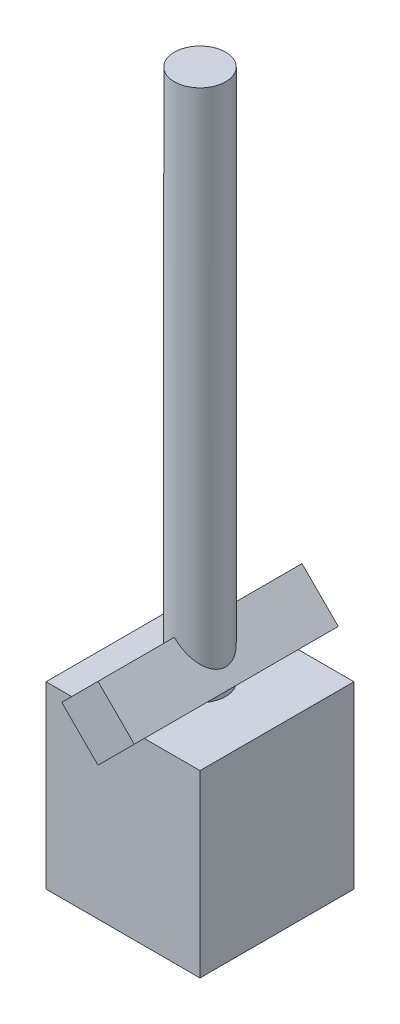
ISO-10303-21;
HEADER;
FILE_DESCRIPTION(('STEP AP214'),'2;1');
FILE_NAME('part.step','',(''),(''),'','','');
FILE_SCHEMA(('AUTOMOTIVE_DESIGN { 1 0 10303 214 1 1 1 1 }'));
ENDSEC;
DATA;
#1=APPLICATION_CONTEXT('core data for automotive mechanical design processes');
#2=APPLICATION_PROTOCOL_DEFINITION('international standard','automotive_design',2000,#1);
#3=PRODUCT_CONTEXT('',#1,'mechanical');
#4=PRODUCT('Part','Part','',(#3));
#5=PRODUCT_RELATED_PRODUCT_CATEGORY('part','',(#4));
#6=PRODUCT_DEFINITION_FORMATION('','',#4);
#7=PRODUCT_DEFINITION_CONTEXT('part definition',#1,'design');
#8=PRODUCT_DEFINITION('design','',#6,#7);
#9=PRODUCT_DEFINITION_SHAPE('','',#8);
#10=(LENGTH_UNIT() NAMED_UNIT(*) SI_UNIT(.MILLI.,.METRE.));
#11=(NAMED_UNIT(*) PLANE_ANGLE_UNIT() SI_UNIT($,.RADIAN.));
#12=(NAMED_UNIT(*) SI_UNIT($,.STERADIAN.) SOLID_ANGLE_UNIT());
#13=UNCERTAINTY_MEASURE_WITH_UNIT(LENGTH_MEASURE(1.E-05),#10,'distance_accuracy_value','');
#14=(GEOMETRIC_REPRESENTATION_CONTEXT(3) GLOBAL_UNCERTAINTY_ASSIGNED_CONTEXT((#13)) GLOBAL_UNIT_ASSIGNED_CONTEXT((#10,
#11,#12)) REPRESENTATION_CONTEXT('',''));
#15=CARTESIAN_POINT('',(0.,0.,0.));
#16=DIRECTION('',(0.,0.,1.));
#17=DIRECTION('',(1.,0.,0.));
#18=AXIS2_PLACEMENT_3D('',#15,#16,#17);
#19=CARTESIAN_POINT('',(0.,-11.3137084989848,15.9));
#20=DIRECTION('',(0.707106781186547,0.707106781186547,0.));
#21=DIRECTION('',(-0.707106781186548,0.707106781186548,0.));
#22=AXIS2_PLACEMENT_3D('',#19,#20,#21);
#23=PLANE('',#22);
#24=CARTESIAN_POINT('',(0.,-11.3137084989848,0.));
#25=DIRECTION('',(0.707106781186547,0.707106781186547,0.));
#26=DIRECTION('',(0.707106781186548,-0.707106781186548,0.));
#27=AXIS2_PLACEMENT_3D('',#24,#25,#26);
#28=ELLIPSE('',#27,5.65685424949238,4.);
#29=CARTESIAN_POINT('',(-3.31370849898476,-8.00000000000001,2.24038746286355));
#30=VERTEX_POINT('',#29);
#31=CARTESIAN_POINT('',(-3.31370849898476,-8.,-2.24038746286355));
#32=VERTEX_POINT('',#31);
#33=EDGE_CURVE('E63',#30,#32,#28,.F.);
#34=ORIENTED_EDGE('',*,*,#33,.F.);
#35=DIRECTION('',(0.,0.,-1.));
#36=VECTOR('',#35,1.);
#37=CARTESIAN_POINT('',(-3.31370849898476,-8.,15.9));
#38=LINE('',#37,#36);
#39=CARTESIAN_POINT('',(-3.31370849898476,-8.,12.));
#40=VERTEX_POINT('',#39);
#41=EDGE_CURVE('E210',#40,#30,#38,.T.);
#42=ORIENTED_EDGE('',*,*,#41,.F.);
#43=DIRECTION('',(0.707106781186548,-0.707106781186548,0.));
#44=VECTOR('',#43,1.);
#45=CARTESIAN_POINT('',(0.,-11.3137084989848,12.));
#46=LINE('',#45,#44);
#47=CARTESIAN_POINT('',(0.,-11.3137084989848,12.));
#48=VERTEX_POINT('',#47);
#49=EDGE_CURVE('E204',#40,#48,#46,.T.);
#50=ORIENTED_EDGE('',*,*,#49,.T.);
#51=DIRECTION('',(0.,0.,-1.));
#52=VECTOR('',#51,1.);
#53=CARTESIAN_POINT('',(0.,-11.3137084989848,15.9));
#54=LINE('',#53,#52);
#55=CARTESIAN_POINT('',(0.,-11.3137084989848,15.9));
#56=VERTEX_POINT('',#55);
#57=EDGE_CURVE('E237',#56,#48,#54,.T.);
#58=ORIENTED_EDGE('',*,*,#57,.F.);
#59=DIRECTION('',(0.707106781186547,-0.707106781186547,0.));
#60=VECTOR('',#59,1.);
#61=CARTESIAN_POINT('',(0.,-11.3137084989848,15.9));
#62=LINE('',#61,#60);
#63=CARTESIAN_POINT('',(-5.65685424949238,-5.65685424949238,15.9));
#64=VERTEX_POINT('',#63);
#65=EDGE_CURVE('E213',#64,#56,#62,.T.);
#66=ORIENTED_EDGE('',*,*,#65,.F.);
#67=DIRECTION('',(0.,0.,-1.));
#68=VECTOR('',#67,1.);
#69=CARTESIAN_POINT('',(-5.65685424949238,-5.65685424949238,15.9));
#70=LINE('',#69,#68);
#71=CARTESIAN_POINT('',(-5.65685424949238,-5.65685424949238,-15.9));
#72=VERTEX_POINT('',#71);
#73=EDGE_CURVE('E236',#64,#72,#70,.T.);
#74=ORIENTED_EDGE('',*,*,#73,.T.);
#75=DIRECTION('',(0.707106781186547,-0.707106781186547,0.));
#76=VECTOR('',#75,1.);
#77=CARTESIAN_POINT('',(0.,-11.3137084989848,-15.9));
#78=LINE('',#77,#76);
#79=CARTESIAN_POINT('',(0.,-11.3137084989848,-15.9));
#80=VERTEX_POINT('',#79);
#81=EDGE_CURVE('E224',#72,#80,#78,.T.);
#82=ORIENTED_EDGE('',*,*,#81,.T.);
#83=CARTESIAN_POINT('',(0.,-11.3137084989848,-12.));
#84=VERTEX_POINT('',#83);
#85=EDGE_CURVE('E234',#84,#80,#54,.T.);
#86=ORIENTED_EDGE('',*,*,#85,.F.);
#87=DIRECTION('',(0.707106781186548,-0.707106781186548,0.));
#88=VECTOR('',#87,1.);
#89=CARTESIAN_POINT('',(0.,-11.3137084989848,-12.));
#90=LINE('',#89,#88);
#91=CARTESIAN_POINT('',(-3.31370849898476,-8.,-12.));
#92=VERTEX_POINT('',#91);
#93=EDGE_CURVE('E203',#92,#84,#90,.T.);
#94=ORIENTED_EDGE('',*,*,#93,.F.);
#95=EDGE_CURVE('E206',#32,#92,#38,.T.);
#96=ORIENTED_EDGE('',*,*,#95,.F.);
#97=EDGE_LOOP('',(#34,#42,#50,#58,#66,#74,#82,#86,#94,#96));
#98=FACE_BOUND('',#97,.T.);
#99=ADVANCED_FACE('F41',(#98),#23,.F.);
#100=CARTESIAN_POINT('',(5.65685424949238,-5.65685424949238,15.9));
#101=DIRECTION('',(-0.707106781186547,0.707106781186547,0.));
#102=DIRECTION('',(-0.707106781186548,-0.707106781186548,0.));
#103=AXIS2_PLACEMENT_3D('',#100,#101,#102);
#104=PLANE('',#103);
#105=CARTESIAN_POINT('',(0.,-11.3137084989848,0.));
#106=DIRECTION('',(-0.707106781186547,0.707106781186547,0.));
#107=DIRECTION('',(-0.707106781186548,-0.707106781186548,0.));
#108=AXIS2_PLACEMENT_3D('',#105,#106,#107);
#109=ELLIPSE('',#108,5.65685424949238,4.);
#110=CARTESIAN_POINT('',(3.31370849898476,-8.00000000000001,-2.24038746286355));
#111=VERTEX_POINT('',#110);
#112=CARTESIAN_POINT('',(3.31370849898476,-8.,2.24038746286355));
#113=VERTEX_POINT('',#112);
#114=EDGE_CURVE('E144',#111,#113,#109,.F.);
#115=ORIENTED_EDGE('',*,*,#114,.F.);
#116=DIRECTION('',(0.,0.,1.));
#117=VECTOR('',#116,1.);
#118=CARTESIAN_POINT('',(3.31370849898476,-8.,15.9));
#119=LINE('',#118,#117);
#120=CARTESIAN_POINT('',(3.31370849898476,-8.,-12.));
#121=VERTEX_POINT('',#120);
#122=EDGE_CURVE('E47',#121,#111,#119,.T.);
#123=ORIENTED_EDGE('',*,*,#122,.F.);
#124=DIRECTION('',(0.707106781186548,0.707106781186548,0.));
#125=VECTOR('',#124,1.);
#126=CARTESIAN_POINT('',(5.65685424949238,-5.65685424949238,-12.));
#127=LINE('',#126,#125);
#128=EDGE_CURVE('E155',#84,#121,#127,.T.);
#129=ORIENTED_EDGE('',*,*,#128,.F.);
#130=ORIENTED_EDGE('',*,*,#85,.T.);
#131=DIRECTION('',(0.707106781186547,0.707106781186547,0.));
#132=VECTOR('',#131,1.);
#133=CARTESIAN_POINT('',(5.65685424949238,-5.65685424949238,-15.9));
#134=LINE('',#133,#132);
#135=CARTESIAN_POINT('',(5.65685424949238,-5.65685424949238,-15.9));
#136=VERTEX_POINT('',#135);
#137=EDGE_CURVE('E226',#80,#136,#134,.T.);
#138=ORIENTED_EDGE('',*,*,#137,.T.);
#139=DIRECTION('',(0.,0.,-1.));
#140=VECTOR('',#139,1.);
#141=CARTESIAN_POINT('',(5.65685424949238,-5.65685424949238,15.9));
#142=LINE('',#141,#140);
#143=CARTESIAN_POINT('',(5.65685424949238,-5.65685424949238,15.9));
#144=VERTEX_POINT('',#143);
#145=EDGE_CURVE('E235',#144,#136,#142,.T.);
#146=ORIENTED_EDGE('',*,*,#145,.F.);
#147=DIRECTION('',(0.707106781186547,0.707106781186547,0.));
#148=VECTOR('',#147,1.);
#149=CARTESIAN_POINT('',(5.65685424949238,-5.65685424949238,15.9));
#150=LINE('',#149,#148);
#151=EDGE_CURVE('E216',#56,#144,#150,.T.);
#152=ORIENTED_EDGE('',*,*,#151,.F.);
#153=ORIENTED_EDGE('',*,*,#57,.T.);
#154=DIRECTION('',(0.707106781186548,0.707106781186548,0.));
#155=VECTOR('',#154,1.);
#156=CARTESIAN_POINT('',(5.65685424949238,-5.65685424949238,12.));
#157=LINE('',#156,#155);
#158=CARTESIAN_POINT('',(3.31370849898476,-8.,12.));
#159=VERTEX_POINT('',#158);
#160=EDGE_CURVE('E11',#48,#159,#157,.T.);
#161=ORIENTED_EDGE('',*,*,#160,.T.);
#162=EDGE_CURVE('E143',#113,#159,#119,.T.);
#163=ORIENTED_EDGE('',*,*,#162,.F.);
#164=EDGE_LOOP('',(#115,#123,#129,#130,#138,#146,#152,#153,#161,#163));
#165=FACE_BOUND('',#164,.T.);
#166=ADVANCED_FACE('F141',(#165),#104,.F.);
#167=CARTESIAN_POINT('',(-5.65685424949238,-5.65685424949238,15.9));
#168=DIRECTION('',(0.707106781186547,-0.707106781186547,0.));
#169=DIRECTION('',(0.707106781186548,0.707106781186548,0.));
#170=AXIS2_PLACEMENT_3D('',#167,#168,#169);
#171=PLANE('',#170);
#172=CARTESIAN_POINT('',(0.,0.,0.));
#173=DIRECTION('',(0.707106781186547,-0.707106781186547,0.));
#174=DIRECTION('',(-0.707106781186548,-0.707106781186548,0.));
#175=AXIS2_PLACEMENT_3D('',#172,#173,#174);
#176=ELLIPSE('',#175,5.65685424949238,4.);
#177=CARTESIAN_POINT('',(0.,0.,-4.));
#178=VERTEX_POINT('',#177);
#179=CARTESIAN_POINT('',(0.,0.,4.));
#180=VERTEX_POINT('',#179);
#181=EDGE_CURVE('E165',#178,#180,#176,.F.);
#182=ORIENTED_EDGE('',*,*,#181,.F.);
#183=DIRECTION('',(0.,0.,-1.));
#184=VECTOR('',#183,1.);
#185=CARTESIAN_POINT('',(0.,0.,15.9));
#186=LINE('',#185,#184);
#187=CARTESIAN_POINT('',(0.,0.,-15.9));
#188=VERTEX_POINT('',#187);
#189=EDGE_CURVE('E219',#178,#188,#186,.T.);
#190=ORIENTED_EDGE('',*,*,#189,.T.);
#191=DIRECTION('',(-0.707106781186547,-0.707106781186547,0.));
#192=VECTOR('',#191,1.);
#193=CARTESIAN_POINT('',(-5.65685424949238,-5.65685424949238,-15.9));
#194=LINE('',#193,#192);
#195=EDGE_CURVE('E207',#188,#72,#194,.T.);
#196=ORIENTED_EDGE('',*,*,#195,.T.);
#197=ORIENTED_EDGE('',*,*,#73,.F.);
#198=DIRECTION('',(-0.707106781186547,-0.707106781186547,0.));
#199=VECTOR('',#198,1.);
#200=CARTESIAN_POINT('',(-5.65685424949238,-5.65685424949238,15.9));
#201=LINE('',#200,#199);
#202=CARTESIAN_POINT('',(0.,0.,15.9));
#203=VERTEX_POINT('',#202);
#204=EDGE_CURVE('E209',#203,#64,#201,.T.);
#205=ORIENTED_EDGE('',*,*,#204,.F.);
#206=EDGE_CURVE('E230',#203,#180,#186,.T.);
#207=ORIENTED_EDGE('',*,*,#206,.T.);
#208=EDGE_LOOP('',(#182,#190,#196,#197,#205,#207));
#209=FACE_BOUND('',#208,.T.);
#210=ADVANCED_FACE('F43',(#209),#171,.F.);
#211=CARTESIAN_POINT('',(0.,0.,15.9));
#212=DIRECTION('',(-0.707106781186547,-0.707106781186547,0.));
#213=DIRECTION('',(0.707106781186548,-0.707106781186548,0.));
#214=AXIS2_PLACEMENT_3D('',#211,#212,#213);
#215=PLANE('',#214);
#216=CARTESIAN_POINT('',(0.,0.,0.));
#217=DIRECTION('',(-0.707106781186547,-0.707106781186547,0.));
#218=DIRECTION('',(0.707106781186548,-0.707106781186548,0.));
#219=AXIS2_PLACEMENT_3D('',#216,#217,#218);
#220=ELLIPSE('',#219,5.65685424949238,4.);
#221=EDGE_CURVE('E57',#180,#178,#220,.F.);
#222=ORIENTED_EDGE('',*,*,#221,.F.);
#223=ORIENTED_EDGE('',*,*,#206,.F.);
#224=DIRECTION('',(-0.707106781186547,0.707106781186547,0.));
#225=VECTOR('',#224,1.);
#226=CARTESIAN_POINT('',(0.,0.,15.9));
#227=LINE('',#226,#225);
#228=EDGE_CURVE('E217',#144,#203,#227,.T.);
#229=ORIENTED_EDGE('',*,*,#228,.F.);
#230=ORIENTED_EDGE('',*,*,#145,.T.);
#231=DIRECTION('',(-0.707106781186547,0.707106781186547,0.));
#232=VECTOR('',#231,1.);
#233=CARTESIAN_POINT('',(0.,0.,-15.9));
#234=LINE('',#233,#232);
#235=EDGE_CURVE('E212',#136,#188,#234,.T.);
#236=ORIENTED_EDGE('',*,*,#235,.T.);
#237=ORIENTED_EDGE('',*,*,#189,.F.);
#238=EDGE_LOOP('',(#222,#223,#229,#230,#236,#237));
#239=FACE_BOUND('',#238,.T.);
#240=ADVANCED_FACE('F272',(#239),#215,.F.);
#241=CARTESIAN_POINT('',(0.,0.,15.9));
#242=DIRECTION('',(0.,0.,-1.));
#243=DIRECTION('',(-1.,0.,0.));
#244=AXIS2_PLACEMENT_3D('',#241,#242,#243);
#245=PLANE('',#244);
#246=ORIENTED_EDGE('',*,*,#204,.T.);
#247=ORIENTED_EDGE('',*,*,#65,.T.);
#248=ORIENTED_EDGE('',*,*,#151,.T.);
#249=ORIENTED_EDGE('',*,*,#228,.T.);
#250=EDGE_LOOP('',(#246,#247,#248,#249));
#251=FACE_BOUND('',#250,.T.);
#252=ADVANCED_FACE('F306',(#251),#245,.F.);
#253=CARTESIAN_POINT('',(0.,0.,-15.9));
#254=DIRECTION('',(0.,0.,-1.));
#255=DIRECTION('',(-1.,0.,0.));
#256=AXIS2_PLACEMENT_3D('',#253,#254,#255);
#257=PLANE('',#256);
#258=ORIENTED_EDGE('',*,*,#195,.F.);
#259=ORIENTED_EDGE('',*,*,#235,.F.);
#260=ORIENTED_EDGE('',*,*,#137,.F.);
#261=ORIENTED_EDGE('',*,*,#81,.F.);
#262=EDGE_LOOP('',(#258,#259,#260,#261));
#263=FACE_BOUND('',#262,.T.);
#264=ADVANCED_FACE('F274',(#263),#257,.T.);
#265=CARTESIAN_POINT('',(12.,-8.,12.));
#266=DIRECTION('',(0.,-1.,0.));
#267=DIRECTION('',(0.,0.,-1.));
#268=AXIS2_PLACEMENT_3D('',#265,#266,#267);
#269=PLANE('',#268);
#270=CARTESIAN_POINT('',(0.,-8.,0.));
#271=DIRECTION('',(0.,1.,0.));
#272=DIRECTION('',(0.,0.,1.));
#273=AXIS2_PLACEMENT_3D('',#270,#271,#272);
#274=CIRCLE('',#273,4.);
#275=EDGE_CURVE('E157',#32,#30,#274,.T.);
#276=ORIENTED_EDGE('',*,*,#275,.F.);
#277=ORIENTED_EDGE('',*,*,#95,.T.);
#278=DIRECTION('',(-1.,0.,0.));
#279=VECTOR('',#278,1.);
#280=CARTESIAN_POINT('',(12.,-8.,-12.));
#281=LINE('',#280,#279);
#282=CARTESIAN_POINT('',(-12.,-8.,-12.));
#283=VERTEX_POINT('',#282);
#284=EDGE_CURVE('E189',#92,#283,#281,.T.);
#285=ORIENTED_EDGE('',*,*,#284,.T.);
#286=DIRECTION('',(0.,0.,-1.));
#287=VECTOR('',#286,1.);
#288=CARTESIAN_POINT('',(-12.,-8.,12.));
#289=LINE('',#288,#287);
#290=CARTESIAN_POINT('',(-12.,-8.,12.));
#291=VERTEX_POINT('',#290);
#292=EDGE_CURVE('E182',#291,#283,#289,.T.);
#293=ORIENTED_EDGE('',*,*,#292,.F.);
#294=DIRECTION('',(-1.,0.,0.));
#295=VECTOR('',#294,1.);
#296=CARTESIAN_POINT('',(12.,-8.,12.));
#297=LINE('',#296,#295);
#298=EDGE_CURVE('E176',#40,#291,#297,.T.);
#299=ORIENTED_EDGE('',*,*,#298,.F.);
#300=ORIENTED_EDGE('',*,*,#41,.T.);
#301=EDGE_LOOP('',(#276,#277,#285,#293,#299,#300));
#302=FACE_BOUND('',#301,.T.);
#303=ADVANCED_FACE('F264',(#302),#269,.F.);
#304=EDGE_CURVE('E152',#113,#111,#274,.T.);
#305=ORIENTED_EDGE('',*,*,#304,.F.);
#306=ORIENTED_EDGE('',*,*,#162,.T.);
#307=CARTESIAN_POINT('',(12.,-8.,12.));
#308=VERTEX_POINT('',#307);
#309=EDGE_CURVE('E177',#308,#159,#297,.T.);
#310=ORIENTED_EDGE('',*,*,#309,.F.);
#311=DIRECTION('',(0.,0.,-1.));
#312=VECTOR('',#311,1.);
#313=CARTESIAN_POINT('',(12.,-8.,12.));
#314=LINE('',#313,#312);
#315=CARTESIAN_POINT('',(12.,-8.,-12.));
#316=VERTEX_POINT('',#315);
#317=EDGE_CURVE('E195',#308,#316,#314,.T.);
#318=ORIENTED_EDGE('',*,*,#317,.T.);
#319=EDGE_CURVE('E173',#316,#121,#281,.T.);
#320=ORIENTED_EDGE('',*,*,#319,.T.);
#321=ORIENTED_EDGE('',*,*,#122,.T.);
#322=EDGE_LOOP('',(#305,#306,#310,#318,#320,#321));
#323=FACE_BOUND('',#322,.T.);
#324=ADVANCED_FACE('F154',(#323),#269,.F.);
#325=CARTESIAN_POINT('',(0.,0.,12.));
#326=DIRECTION('',(0.,0.,1.));
#327=DIRECTION('',(1.,0.,0.));
#328=AXIS2_PLACEMENT_3D('',#325,#326,#327);
#329=PLANE('',#328);
#330=ORIENTED_EDGE('',*,*,#49,.F.);
#331=ORIENTED_EDGE('',*,*,#298,.T.);
#332=DIRECTION('',(0.,-1.,0.));
#333=VECTOR('',#332,1.);
#334=CARTESIAN_POINT('',(-12.,-8.,12.));
#335=LINE('',#334,#333);
#336=CARTESIAN_POINT('',(-12.,-36.,12.));
#337=VERTEX_POINT('',#336);
#338=EDGE_CURVE('E168',#291,#337,#335,.T.);
#339=ORIENTED_EDGE('',*,*,#338,.T.);
#340=DIRECTION('',(1.,0.,0.));
#341=VECTOR('',#340,1.);
#342=CARTESIAN_POINT('',(-12.,-36.,12.));
#343=LINE('',#342,#341);
#344=CARTESIAN_POINT('',(12.,-36.,12.));
#345=VERTEX_POINT('',#344);
#346=EDGE_CURVE('E174',#337,#345,#343,.T.);
#347=ORIENTED_EDGE('',*,*,#346,.T.);
#348=DIRECTION('',(0.,1.,0.));
#349=VECTOR('',#348,1.);
#350=CARTESIAN_POINT('',(12.,-36.,12.));
#351=LINE('',#350,#349);
#352=EDGE_CURVE('E178',#345,#308,#351,.T.);
#353=ORIENTED_EDGE('',*,*,#352,.T.);
#354=ORIENTED_EDGE('',*,*,#309,.T.);
#355=ORIENTED_EDGE('',*,*,#160,.F.);
#356=EDGE_LOOP('',(#330,#331,#339,#347,#353,#354,#355));
#357=FACE_BOUND('',#356,.T.);
#358=ADVANCED_FACE('F325',(#357),#329,.T.);
#359=CARTESIAN_POINT('',(0.,0.,-12.));
#360=DIRECTION('',(0.,0.,1.));
#361=DIRECTION('',(1.,0.,0.));
#362=AXIS2_PLACEMENT_3D('',#359,#360,#361);
#363=PLANE('',#362);
#364=ORIENTED_EDGE('',*,*,#284,.F.);
#365=ORIENTED_EDGE('',*,*,#93,.T.);
#366=ORIENTED_EDGE('',*,*,#128,.T.);
#367=ORIENTED_EDGE('',*,*,#319,.F.);
#368=DIRECTION('',(0.,1.,0.));
#369=VECTOR('',#368,1.);
#370=CARTESIAN_POINT('',(12.,-36.,-12.));
#371=LINE('',#370,#369);
#372=CARTESIAN_POINT('',(12.,-36.,-12.));
#373=VERTEX_POINT('',#372);
#374=EDGE_CURVE('E186',#373,#316,#371,.T.);
#375=ORIENTED_EDGE('',*,*,#374,.F.);
#376=DIRECTION('',(1.,0.,0.));
#377=VECTOR('',#376,1.);
#378=CARTESIAN_POINT('',(-12.,-36.,-12.));
#379=LINE('',#378,#377);
#380=CARTESIAN_POINT('',(-12.,-36.,-12.));
#381=VERTEX_POINT('',#380);
#382=EDGE_CURVE('E184',#381,#373,#379,.T.);
#383=ORIENTED_EDGE('',*,*,#382,.F.);
#384=DIRECTION('',(0.,-1.,0.));
#385=VECTOR('',#384,1.);
#386=CARTESIAN_POINT('',(-12.,-8.,-12.));
#387=LINE('',#386,#385);
#388=EDGE_CURVE('E163',#283,#381,#387,.T.);
#389=ORIENTED_EDGE('',*,*,#388,.F.);
#390=EDGE_LOOP('',(#364,#365,#366,#367,#375,#383,#389));
#391=FACE_BOUND('',#390,.T.);
#392=ADVANCED_FACE('F245',(#391),#363,.F.);
#393=CARTESIAN_POINT('',(-12.,-8.,12.));
#394=DIRECTION('',(1.,0.,0.));
#395=DIRECTION('',(0.,0.,-1.));
#396=AXIS2_PLACEMENT_3D('',#393,#394,#395);
#397=PLANE('',#396);
#398=ORIENTED_EDGE('',*,*,#388,.T.);
#399=DIRECTION('',(0.,0.,-1.));
#400=VECTOR('',#399,1.);
#401=CARTESIAN_POINT('',(-12.,-36.,12.));
#402=LINE('',#401,#400);
#403=EDGE_CURVE('E196',#337,#381,#402,.T.);
#404=ORIENTED_EDGE('',*,*,#403,.F.);
#405=ORIENTED_EDGE('',*,*,#338,.F.);
#406=ORIENTED_EDGE('',*,*,#292,.T.);
#407=EDGE_LOOP('',(#398,#404,#405,#406));
#408=FACE_BOUND('',#407,.T.);
#409=ADVANCED_FACE('F257',(#408),#397,.F.);
#410=CARTESIAN_POINT('',(-12.,-36.,12.));
#411=DIRECTION('',(0.,1.,0.));
#412=DIRECTION('',(0.,0.,1.));
#413=AXIS2_PLACEMENT_3D('',#410,#411,#412);
#414=PLANE('',#413);
#415=ORIENTED_EDGE('',*,*,#382,.T.);
#416=DIRECTION('',(0.,0.,-1.));
#417=VECTOR('',#416,1.);
#418=CARTESIAN_POINT('',(12.,-36.,12.));
#419=LINE('',#418,#417);
#420=EDGE_CURVE('E194',#345,#373,#419,.T.);
#421=ORIENTED_EDGE('',*,*,#420,.F.);
#422=ORIENTED_EDGE('',*,*,#346,.F.);
#423=ORIENTED_EDGE('',*,*,#403,.T.);
#424=EDGE_LOOP('',(#415,#421,#422,#423));
#425=FACE_BOUND('',#424,.T.);
#426=ADVANCED_FACE('F260',(#425),#414,.F.);
#427=CARTESIAN_POINT('',(12.,-36.,12.));
#428=DIRECTION('',(-1.,0.,0.));
#429=DIRECTION('',(0.,0.,1.));
#430=AXIS2_PLACEMENT_3D('',#427,#428,#429);
#431=PLANE('',#430);
#432=ORIENTED_EDGE('',*,*,#374,.T.);
#433=ORIENTED_EDGE('',*,*,#317,.F.);
#434=ORIENTED_EDGE('',*,*,#352,.F.);
#435=ORIENTED_EDGE('',*,*,#420,.T.);
#436=EDGE_LOOP('',(#432,#433,#434,#435));
#437=FACE_BOUND('',#436,.T.);
#438=ADVANCED_FACE('F252',(#437),#431,.F.);
#439=CARTESIAN_POINT('',(0.,75.,0.));
#440=DIRECTION('',(0.,1.,0.));
#441=DIRECTION('',(0.,0.,1.));
#442=AXIS2_PLACEMENT_3D('',#439,#440,#441);
#443=PLANE('',#442);
#444=CARTESIAN_POINT('',(0.,75.,0.));
#445=DIRECTION('',(0.,1.,0.));
#446=DIRECTION('',(0.,0.,1.));
#447=AXIS2_PLACEMENT_3D('',#444,#445,#446);
#448=CIRCLE('',#447,4.);
#449=CARTESIAN_POINT('',(0.,75.,4.));
#450=VERTEX_POINT('',#449);
#451=EDGE_CURVE('E158',#450,#450,#448,.T.);
#452=ORIENTED_EDGE('',*,*,#451,.T.);
#453=EDGE_LOOP('',(#452));
#454=FACE_BOUND('',#453,.T.);
#455=ADVANCED_FACE('F288',(#454),#443,.T.);
#456=CARTESIAN_POINT('',(0.,75.,0.));
#457=DIRECTION('',(0.,-1.,0.));
#458=DIRECTION('',(0.,0.,-1.));
#459=AXIS2_PLACEMENT_3D('',#456,#457,#458);
#460=CYLINDRICAL_SURFACE('',#459,4.);
#461=ORIENTED_EDGE('',*,*,#451,.F.);
#462=EDGE_LOOP('',(#461));
#463=FACE_BOUND('',#462,.T.);
#464=ORIENTED_EDGE('',*,*,#221,.T.);
#465=ORIENTED_EDGE('',*,*,#181,.T.);
#466=EDGE_LOOP('',(#464,#465));
#467=FACE_BOUND('',#466,.T.);
#468=ADVANCED_FACE('F281',(#463,#467),#460,.T.);
#469=ORIENTED_EDGE('',*,*,#304,.T.);
#470=ORIENTED_EDGE('',*,*,#114,.T.);
#471=EDGE_LOOP('',(#469,#470));
#472=FACE_BOUND('',#471,.T.);
#473=ADVANCED_FACE('F161',(#472),#460,.T.);
#474=ORIENTED_EDGE('',*,*,#275,.T.);
#475=ORIENTED_EDGE('',*,*,#33,.T.);
#476=EDGE_LOOP('',(#474,#475));
#477=FACE_BOUND('',#476,.T.);
#478=ADVANCED_FACE('F289',(#477),#460,.T.);
#479=CLOSED_SHELL('',(#99,#166,#210,#240,#252,#264,#303,#324,#358,#392,#409,#426,#438,#455,#468,
#473,#478));
#480=MANIFOLD_SOLID_BREP('B2',#479);
#481=ADVANCED_BREP_SHAPE_REPRESENTATION('',(#18,#480),#14);
#482=SHAPE_DEFINITION_REPRESENTATION(#9,#481);
ENDSEC;
END-ISO-10303-21;
